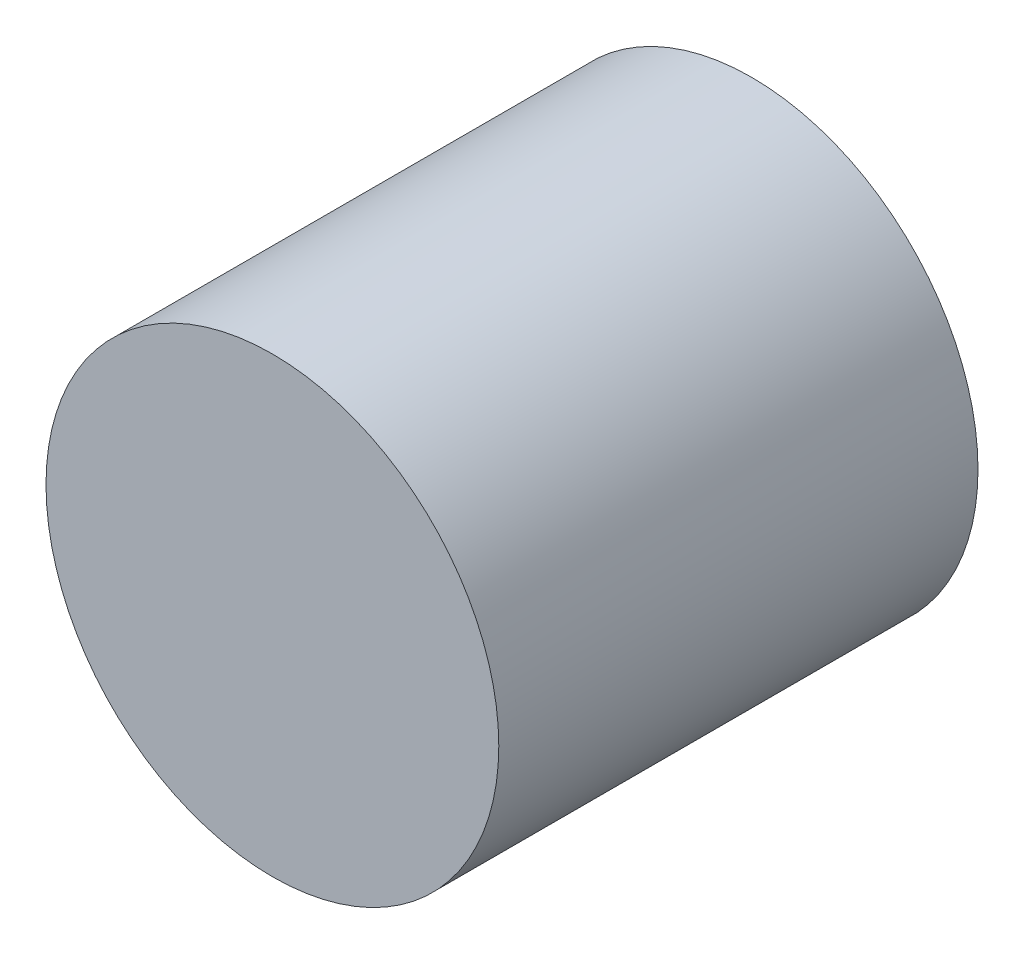
ISO-10303-21;
HEADER;
FILE_DESCRIPTION(('STEP AP214'),'2;1');
FILE_NAME('part.step','',(''),(''),'','','');
FILE_SCHEMA(('AUTOMOTIVE_DESIGN { 1 0 10303 214 1 1 1 1 }'));
ENDSEC;
DATA;
#1=APPLICATION_CONTEXT('core data for automotive mechanical design processes');
#2=APPLICATION_PROTOCOL_DEFINITION('international standard','automotive_design',2000,#1);
#3=PRODUCT_CONTEXT('',#1,'mechanical');
#4=PRODUCT('Part','Part','',(#3));
#5=PRODUCT_RELATED_PRODUCT_CATEGORY('part','',(#4));
#6=PRODUCT_DEFINITION_FORMATION('','',#4);
#7=PRODUCT_DEFINITION_CONTEXT('part definition',#1,'design');
#8=PRODUCT_DEFINITION('design','',#6,#7);
#9=PRODUCT_DEFINITION_SHAPE('','',#8);
#10=(LENGTH_UNIT() NAMED_UNIT(*) SI_UNIT(.MILLI.,.METRE.));
#11=(NAMED_UNIT(*) PLANE_ANGLE_UNIT() SI_UNIT($,.RADIAN.));
#12=(NAMED_UNIT(*) SI_UNIT($,.STERADIAN.) SOLID_ANGLE_UNIT());
#13=UNCERTAINTY_MEASURE_WITH_UNIT(LENGTH_MEASURE(1.E-05),#10,'distance_accuracy_value','');
#14=(GEOMETRIC_REPRESENTATION_CONTEXT(3) GLOBAL_UNCERTAINTY_ASSIGNED_CONTEXT((#13)) GLOBAL_UNIT_ASSIGNED_CONTEXT((#10,
#11,#12)) REPRESENTATION_CONTEXT('',''));
#15=CARTESIAN_POINT('',(0.,0.,0.));
#16=DIRECTION('',(0.,0.,1.));
#17=DIRECTION('',(1.,0.,0.));
#18=AXIS2_PLACEMENT_3D('',#15,#16,#17);
#19=CARTESIAN_POINT('',(0.,0.,6.35));
#20=DIRECTION('',(0.,0.,-1.));
#21=DIRECTION('',(-1.,0.,0.));
#22=AXIS2_PLACEMENT_3D('',#19,#20,#21);
#23=CYLINDRICAL_SURFACE('',#22,3.);
#24=CARTESIAN_POINT('',(0.,0.,6.35));
#25=DIRECTION('',(0.,0.,1.));
#26=DIRECTION('',(1.,0.,0.));
#27=AXIS2_PLACEMENT_3D('',#24,#25,#26);
#28=CIRCLE('',#27,3.);
#29=CARTESIAN_POINT('',(3.,0.,6.35));
#30=VERTEX_POINT('',#29);
#31=EDGE_CURVE('E10',#30,#30,#28,.T.);
#32=ORIENTED_EDGE('',*,*,#31,.F.);
#33=EDGE_LOOP('',(#32));
#34=FACE_BOUND('',#33,.T.);
#35=CARTESIAN_POINT('',(0.,0.,0.));
#36=DIRECTION('',(0.,0.,1.));
#37=DIRECTION('',(1.,0.,0.));
#38=AXIS2_PLACEMENT_3D('',#35,#36,#37);
#39=CIRCLE('',#38,3.);
#40=CARTESIAN_POINT('',(3.,0.,0.));
#41=VERTEX_POINT('',#40);
#42=EDGE_CURVE('E34',#41,#41,#39,.T.);
#43=ORIENTED_EDGE('',*,*,#42,.T.);
#44=EDGE_LOOP('',(#43));
#45=FACE_BOUND('',#44,.T.);
#46=ADVANCED_FACE('F31',(#34,#45),#23,.T.);
#47=CARTESIAN_POINT('',(0.,0.,6.35));
#48=DIRECTION('',(0.,0.,1.));
#49=DIRECTION('',(1.,0.,0.));
#50=AXIS2_PLACEMENT_3D('',#47,#48,#49);
#51=PLANE('',#50);
#52=ORIENTED_EDGE('',*,*,#31,.T.);
#53=EDGE_LOOP('',(#52));
#54=FACE_BOUND('',#53,.T.);
#55=ADVANCED_FACE('F46',(#54),#51,.T.);
#56=CARTESIAN_POINT('',(0.,0.,0.));
#57=DIRECTION('',(0.,0.,1.));
#58=DIRECTION('',(1.,0.,0.));
#59=AXIS2_PLACEMENT_3D('',#56,#57,#58);
#60=PLANE('',#59);
#61=ORIENTED_EDGE('',*,*,#42,.F.);
#62=EDGE_LOOP('',(#61));
#63=FACE_BOUND('',#62,.T.);
#64=ADVANCED_FACE('F44',(#63),#60,.F.);
#65=CLOSED_SHELL('',(#46,#55,#64));
#66=MANIFOLD_SOLID_BREP('B2',#65);
#67=ADVANCED_BREP_SHAPE_REPRESENTATION('',(#18,#66),#14);
#68=SHAPE_DEFINITION_REPRESENTATION(#9,#67);
ENDSEC;
END-ISO-10303-21;
